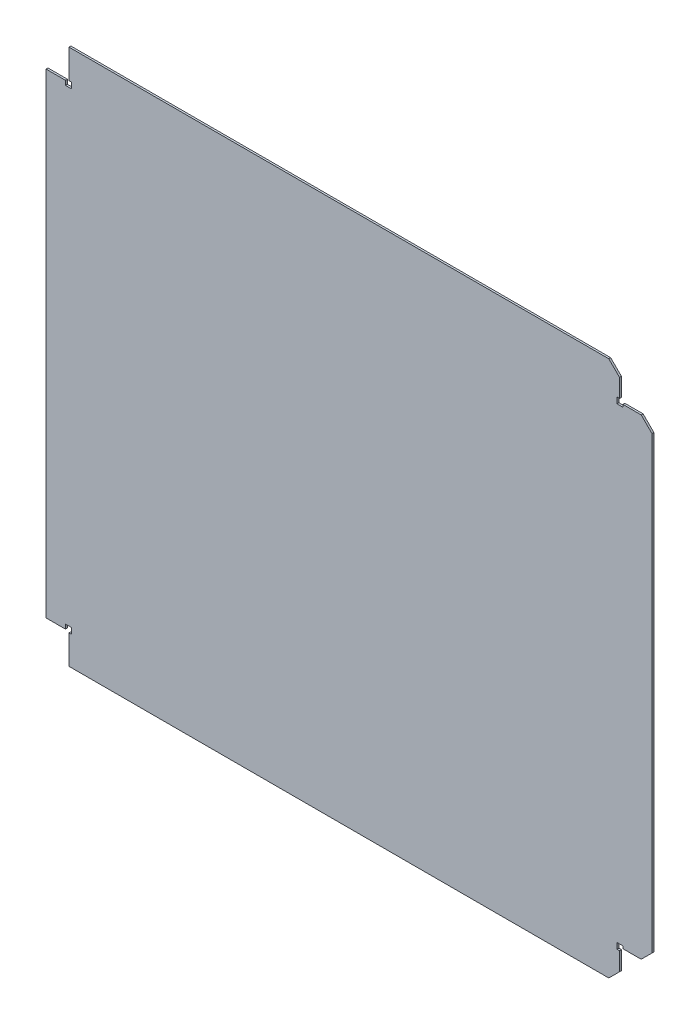
ISO-10303-21;
HEADER;
FILE_DESCRIPTION(('STEP AP214'),'2;1');
FILE_NAME('part.step','',(''),(''),'','','');
FILE_SCHEMA(('AUTOMOTIVE_DESIGN { 1 0 10303 214 1 1 1 1 }'));
ENDSEC;
DATA;
#1=APPLICATION_CONTEXT('core data for automotive mechanical design processes');
#2=APPLICATION_PROTOCOL_DEFINITION('international standard','automotive_design',2000,#1);
#3=PRODUCT_CONTEXT('',#1,'mechanical');
#4=PRODUCT('Part','Part','',(#3));
#5=PRODUCT_RELATED_PRODUCT_CATEGORY('part','',(#4));
#6=PRODUCT_DEFINITION_FORMATION('','',#4);
#7=PRODUCT_DEFINITION_CONTEXT('part definition',#1,'design');
#8=PRODUCT_DEFINITION('design','',#6,#7);
#9=PRODUCT_DEFINITION_SHAPE('','',#8);
#10=(LENGTH_UNIT() NAMED_UNIT(*) SI_UNIT(.MILLI.,.METRE.));
#11=(NAMED_UNIT(*) PLANE_ANGLE_UNIT() SI_UNIT($,.RADIAN.));
#12=(NAMED_UNIT(*) SI_UNIT($,.STERADIAN.) SOLID_ANGLE_UNIT());
#13=UNCERTAINTY_MEASURE_WITH_UNIT(LENGTH_MEASURE(1.E-05),#10,'distance_accuracy_value','');
#14=(GEOMETRIC_REPRESENTATION_CONTEXT(3) GLOBAL_UNCERTAINTY_ASSIGNED_CONTEXT((#13)) GLOBAL_UNIT_ASSIGNED_CONTEXT((#10,
#11,#12)) REPRESENTATION_CONTEXT('',''));
#15=CARTESIAN_POINT('',(0.,0.,0.));
#16=DIRECTION('',(0.,0.,1.));
#17=DIRECTION('',(1.,0.,0.));
#18=AXIS2_PLACEMENT_3D('',#15,#16,#17);
#19=CARTESIAN_POINT('',(172.2,0.,-895.746524373547));
#20=DIRECTION('',(1.,0.,0.));
#21=DIRECTION('',(0.,0.,-1.));
#22=AXIS2_PLACEMENT_3D('',#19,#20,#21);
#23=PLANE('',#22);
#24=DIRECTION('',(0.,0.,1.));
#25=VECTOR('',#24,1.);
#26=CARTESIAN_POINT('',(172.2,-147.2,-895.746524373547));
#27=LINE('',#26,#25);
#28=CARTESIAN_POINT('',(172.2,-147.2,13.8));
#29=VERTEX_POINT('',#28);
#30=CARTESIAN_POINT('',(172.2,-147.2,14.9999999999998));
#31=VERTEX_POINT('',#30);
#32=EDGE_CURVE('E526',#29,#31,#27,.T.);
#33=ORIENTED_EDGE('',*,*,#32,.T.);
#34=DIRECTION('',(0.,1.,0.));
#35=VECTOR('',#34,1.);
#36=CARTESIAN_POINT('',(172.2,0.,15.));
#37=LINE('',#36,#35);
#38=CARTESIAN_POINT('',(172.2,-150.913274122872,15.));
#39=VERTEX_POINT('',#38);
#40=EDGE_CURVE('E94',#39,#31,#37,.T.);
#41=ORIENTED_EDGE('',*,*,#40,.F.);
#42=DIRECTION('',(0.,0.,1.));
#43=VECTOR('',#42,1.);
#44=CARTESIAN_POINT('',(172.2,-150.913274122872,-681.452585149753));
#45=LINE('',#44,#43);
#46=CARTESIAN_POINT('',(172.2,-150.913274122872,13.8));
#47=VERTEX_POINT('',#46);
#48=EDGE_CURVE('E463',#47,#39,#45,.T.);
#49=ORIENTED_EDGE('',*,*,#48,.F.);
#50=DIRECTION('',(0.,1.,0.));
#51=VECTOR('',#50,1.);
#52=CARTESIAN_POINT('',(172.2,0.,13.8));
#53=LINE('',#52,#51);
#54=EDGE_CURVE('E515',#47,#29,#53,.T.);
#55=ORIENTED_EDGE('',*,*,#54,.T.);
#56=EDGE_LOOP('',(#33,#41,#49,#55));
#57=FACE_BOUND('',#56,.T.);
#58=ADVANCED_FACE('F79',(#57),#23,.T.);
#59=CARTESIAN_POINT('',(-172.2,0.,-895.746524373547));
#60=DIRECTION('',(-1.,0.,0.));
#61=DIRECTION('',(0.,0.,1.));
#62=AXIS2_PLACEMENT_3D('',#59,#60,#61);
#63=PLANE('',#62);
#64=DIRECTION('',(0.,-1.,0.));
#65=VECTOR('',#64,1.);
#66=CARTESIAN_POINT('',(-172.2,0.,13.8));
#67=LINE('',#66,#65);
#68=CARTESIAN_POINT('',(-172.2,-147.2,13.7999999999998));
#69=VERTEX_POINT('',#68);
#70=CARTESIAN_POINT('',(-172.2,-150.913274122872,13.8));
#71=VERTEX_POINT('',#70);
#72=EDGE_CURVE('E518',#69,#71,#67,.T.);
#73=ORIENTED_EDGE('',*,*,#72,.T.);
#74=DIRECTION('',(0.,0.,1.));
#75=VECTOR('',#74,1.);
#76=CARTESIAN_POINT('',(-172.2,-150.913274122872,-681.452585149753));
#77=LINE('',#76,#75);
#78=CARTESIAN_POINT('',(-172.2,-150.913274122872,15.));
#79=VERTEX_POINT('',#78);
#80=EDGE_CURVE('E443',#71,#79,#77,.T.);
#81=ORIENTED_EDGE('',*,*,#80,.T.);
#82=DIRECTION('',(0.,-1.,0.));
#83=VECTOR('',#82,1.);
#84=CARTESIAN_POINT('',(-172.2,0.,15.));
#85=LINE('',#84,#83);
#86=CARTESIAN_POINT('',(-172.2,-147.2,15.));
#87=VERTEX_POINT('',#86);
#88=EDGE_CURVE('E511',#87,#79,#85,.T.);
#89=ORIENTED_EDGE('',*,*,#88,.F.);
#90=DIRECTION('',(0.,0.,1.));
#91=VECTOR('',#90,1.);
#92=CARTESIAN_POINT('',(-172.2,-147.2,-895.746524373547));
#93=LINE('',#92,#91);
#94=EDGE_CURVE('E12',#69,#87,#93,.T.);
#95=ORIENTED_EDGE('',*,*,#94,.F.);
#96=EDGE_LOOP('',(#73,#81,#89,#95));
#97=FACE_BOUND('',#96,.T.);
#98=ADVANCED_FACE('F607',(#97),#63,.T.);
#99=CARTESIAN_POINT('',(0.,-147.2,-895.746524373547));
#100=DIRECTION('',(0.,-1.,0.));
#101=DIRECTION('',(0.,0.,-1.));
#102=AXIS2_PLACEMENT_3D('',#99,#100,#101);
#103=PLANE('',#102);
#104=ORIENTED_EDGE('',*,*,#94,.T.);
#105=DIRECTION('',(1.,0.,0.));
#106=VECTOR('',#105,1.);
#107=CARTESIAN_POINT('',(0.,-147.2,15.));
#108=LINE('',#107,#106);
#109=CARTESIAN_POINT('',(-175.913274122872,-147.2,15.));
#110=VERTEX_POINT('',#109);
#111=EDGE_CURVE('E509',#110,#87,#108,.T.);
#112=ORIENTED_EDGE('',*,*,#111,.F.);
#113=DIRECTION('',(0.,0.,1.));
#114=VECTOR('',#113,1.);
#115=CARTESIAN_POINT('',(-175.913274122872,-147.2,-586.745885007965));
#116=LINE('',#115,#114);
#117=CARTESIAN_POINT('',(-175.913274122872,-147.2,13.8));
#118=VERTEX_POINT('',#117);
#119=EDGE_CURVE('E1188',#118,#110,#116,.T.);
#120=ORIENTED_EDGE('',*,*,#119,.F.);
#121=DIRECTION('',(1.,0.,0.));
#122=VECTOR('',#121,1.);
#123=CARTESIAN_POINT('',(0.,-147.2,13.8));
#124=LINE('',#123,#122);
#125=EDGE_CURVE('E101',#118,#69,#124,.T.);
#126=ORIENTED_EDGE('',*,*,#125,.T.);
#127=EDGE_LOOP('',(#104,#112,#120,#126));
#128=FACE_BOUND('',#127,.T.);
#129=ADVANCED_FACE('F611',(#128),#103,.T.);
#130=CARTESIAN_POINT('',(0.,147.2,-895.746524373547));
#131=DIRECTION('',(0.,1.,0.));
#132=DIRECTION('',(0.,0.,1.));
#133=AXIS2_PLACEMENT_3D('',#130,#131,#132);
#134=PLANE('',#133);
#135=DIRECTION('',(-1.,0.,0.));
#136=VECTOR('',#135,1.);
#137=CARTESIAN_POINT('',(0.,147.2,13.8));
#138=LINE('',#137,#136);
#139=CARTESIAN_POINT('',(-172.2,147.2,13.7999999999998));
#140=VERTEX_POINT('',#139);
#141=CARTESIAN_POINT('',(-175.913274122872,147.2,13.8));
#142=VERTEX_POINT('',#141);
#143=EDGE_CURVE('E289',#140,#142,#138,.T.);
#144=ORIENTED_EDGE('',*,*,#143,.T.);
#145=DIRECTION('',(0.,0.,1.));
#146=VECTOR('',#145,1.);
#147=CARTESIAN_POINT('',(-175.913274122872,147.2,-586.745885007965));
#148=LINE('',#147,#146);
#149=CARTESIAN_POINT('',(-175.913274122872,147.2,15.));
#150=VERTEX_POINT('',#149);
#151=EDGE_CURVE('E293',#142,#150,#148,.T.);
#152=ORIENTED_EDGE('',*,*,#151,.T.);
#153=DIRECTION('',(-1.,0.,0.));
#154=VECTOR('',#153,1.);
#155=CARTESIAN_POINT('',(0.,147.2,15.));
#156=LINE('',#155,#154);
#157=CARTESIAN_POINT('',(-172.2,147.2,15.));
#158=VERTEX_POINT('',#157);
#159=EDGE_CURVE('E507',#158,#150,#156,.T.);
#160=ORIENTED_EDGE('',*,*,#159,.F.);
#161=DIRECTION('',(0.,0.,1.));
#162=VECTOR('',#161,1.);
#163=CARTESIAN_POINT('',(-172.2,147.2,-895.746524373547));
#164=LINE('',#163,#162);
#165=EDGE_CURVE('E87',#140,#158,#164,.T.);
#166=ORIENTED_EDGE('',*,*,#165,.F.);
#167=EDGE_LOOP('',(#144,#152,#160,#166));
#168=FACE_BOUND('',#167,.T.);
#169=ADVANCED_FACE('F291',(#168),#134,.T.);
#170=CARTESIAN_POINT('',(-172.2,0.,-895.746524373547));
#171=DIRECTION('',(-1.,0.,0.));
#172=DIRECTION('',(0.,0.,1.));
#173=AXIS2_PLACEMENT_3D('',#170,#171,#172);
#174=PLANE('',#173);
#175=ORIENTED_EDGE('',*,*,#165,.T.);
#176=DIRECTION('',(0.,-1.,0.));
#177=VECTOR('',#176,1.);
#178=CARTESIAN_POINT('',(-172.2,0.,15.));
#179=LINE('',#178,#177);
#180=CARTESIAN_POINT('',(-172.2,150.913274122872,15.));
#181=VERTEX_POINT('',#180);
#182=EDGE_CURVE('E505',#181,#158,#179,.T.);
#183=ORIENTED_EDGE('',*,*,#182,.F.);
#184=DIRECTION('',(0.,0.,1.));
#185=VECTOR('',#184,1.);
#186=CARTESIAN_POINT('',(-172.2,150.913274122872,-681.452585149753));
#187=LINE('',#186,#185);
#188=CARTESIAN_POINT('',(-172.2,150.913274122872,13.8));
#189=VERTEX_POINT('',#188);
#190=EDGE_CURVE('E339',#189,#181,#187,.T.);
#191=ORIENTED_EDGE('',*,*,#190,.F.);
#192=DIRECTION('',(0.,-1.,0.));
#193=VECTOR('',#192,1.);
#194=CARTESIAN_POINT('',(-172.2,0.,13.8));
#195=LINE('',#194,#193);
#196=EDGE_CURVE('E297',#189,#140,#195,.T.);
#197=ORIENTED_EDGE('',*,*,#196,.T.);
#198=EDGE_LOOP('',(#175,#183,#191,#197));
#199=FACE_BOUND('',#198,.T.);
#200=ADVANCED_FACE('F532',(#199),#174,.T.);
#201=CARTESIAN_POINT('',(172.2,0.,-895.746524373547));
#202=DIRECTION('',(1.,0.,0.));
#203=DIRECTION('',(0.,0.,-1.));
#204=AXIS2_PLACEMENT_3D('',#201,#202,#203);
#205=PLANE('',#204);
#206=DIRECTION('',(0.,1.,0.));
#207=VECTOR('',#206,1.);
#208=CARTESIAN_POINT('',(172.2,0.,13.8));
#209=LINE('',#208,#207);
#210=CARTESIAN_POINT('',(172.2,147.2,13.7999999999998));
#211=VERTEX_POINT('',#210);
#212=CARTESIAN_POINT('',(172.2,150.913274122872,13.8));
#213=VERTEX_POINT('',#212);
#214=EDGE_CURVE('E522',#211,#213,#209,.T.);
#215=ORIENTED_EDGE('',*,*,#214,.T.);
#216=DIRECTION('',(0.,0.,1.));
#217=VECTOR('',#216,1.);
#218=CARTESIAN_POINT('',(172.2,150.913274122872,-681.452585149753));
#219=LINE('',#218,#217);
#220=CARTESIAN_POINT('',(172.2,150.913274122872,15.));
#221=VERTEX_POINT('',#220);
#222=EDGE_CURVE('E318',#213,#221,#219,.T.);
#223=ORIENTED_EDGE('',*,*,#222,.T.);
#224=DIRECTION('',(0.,1.,0.));
#225=VECTOR('',#224,1.);
#226=CARTESIAN_POINT('',(172.2,0.,15.));
#227=LINE('',#226,#225);
#228=CARTESIAN_POINT('',(172.2,147.2,15.));
#229=VERTEX_POINT('',#228);
#230=EDGE_CURVE('E503',#229,#221,#227,.T.);
#231=ORIENTED_EDGE('',*,*,#230,.F.);
#232=DIRECTION('',(0.,0.,1.));
#233=VECTOR('',#232,1.);
#234=CARTESIAN_POINT('',(172.2,147.2,-895.746524373547));
#235=LINE('',#234,#233);
#236=EDGE_CURVE('E529',#211,#229,#235,.T.);
#237=ORIENTED_EDGE('',*,*,#236,.F.);
#238=EDGE_LOOP('',(#215,#223,#231,#237));
#239=FACE_BOUND('',#238,.T.);
#240=ADVANCED_FACE('F563',(#239),#205,.T.);
#241=CARTESIAN_POINT('',(0.,147.2,-895.746524373547));
#242=DIRECTION('',(0.,1.,0.));
#243=DIRECTION('',(0.,0.,1.));
#244=AXIS2_PLACEMENT_3D('',#241,#242,#243);
#245=PLANE('',#244);
#246=ORIENTED_EDGE('',*,*,#236,.T.);
#247=DIRECTION('',(-1.,0.,0.));
#248=VECTOR('',#247,1.);
#249=CARTESIAN_POINT('',(0.,147.2,15.));
#250=LINE('',#249,#248);
#251=CARTESIAN_POINT('',(175.913274122872,147.2,15.));
#252=VERTEX_POINT('',#251);
#253=EDGE_CURVE('E501',#252,#229,#250,.T.);
#254=ORIENTED_EDGE('',*,*,#253,.F.);
#255=DIRECTION('',(0.,0.,1.));
#256=VECTOR('',#255,1.);
#257=CARTESIAN_POINT('',(175.913274122872,147.2,-581.636102380041));
#258=LINE('',#257,#256);
#259=CARTESIAN_POINT('',(175.913274122872,147.2,13.8));
#260=VERTEX_POINT('',#259);
#261=EDGE_CURVE('E397',#260,#252,#258,.T.);
#262=ORIENTED_EDGE('',*,*,#261,.F.);
#263=DIRECTION('',(-1.,0.,0.));
#264=VECTOR('',#263,1.);
#265=CARTESIAN_POINT('',(0.,147.2,13.8));
#266=LINE('',#265,#264);
#267=EDGE_CURVE('E524',#260,#211,#266,.T.);
#268=ORIENTED_EDGE('',*,*,#267,.T.);
#269=EDGE_LOOP('',(#246,#254,#262,#268));
#270=FACE_BOUND('',#269,.T.);
#271=ADVANCED_FACE('F572',(#270),#245,.T.);
#272=CARTESIAN_POINT('',(0.,-147.2,-895.746524373547));
#273=DIRECTION('',(0.,-1.,0.));
#274=DIRECTION('',(0.,0.,-1.));
#275=AXIS2_PLACEMENT_3D('',#272,#273,#274);
#276=PLANE('',#275);
#277=DIRECTION('',(1.,0.,0.));
#278=VECTOR('',#277,1.);
#279=CARTESIAN_POINT('',(0.,-147.2,13.8));
#280=LINE('',#279,#278);
#281=CARTESIAN_POINT('',(175.913274122872,-147.2,13.8));
#282=VERTEX_POINT('',#281);
#283=EDGE_CURVE('E513',#29,#282,#280,.T.);
#284=ORIENTED_EDGE('',*,*,#283,.T.);
#285=DIRECTION('',(0.,0.,1.));
#286=VECTOR('',#285,1.);
#287=CARTESIAN_POINT('',(175.913274122872,-147.2,-581.636102380041));
#288=LINE('',#287,#286);
#289=CARTESIAN_POINT('',(175.913274122872,-147.2,15.));
#290=VERTEX_POINT('',#289);
#291=EDGE_CURVE('E373',#282,#290,#288,.T.);
#292=ORIENTED_EDGE('',*,*,#291,.T.);
#293=DIRECTION('',(1.,0.,0.));
#294=VECTOR('',#293,1.);
#295=CARTESIAN_POINT('',(0.,-147.2,15.));
#296=LINE('',#295,#294);
#297=EDGE_CURVE('E499',#31,#290,#296,.T.);
#298=ORIENTED_EDGE('',*,*,#297,.F.);
#299=ORIENTED_EDGE('',*,*,#32,.F.);
#300=EDGE_LOOP('',(#284,#292,#298,#299));
#301=FACE_BOUND('',#300,.T.);
#302=ADVANCED_FACE('F598',(#301),#276,.T.);
#303=CARTESIAN_POINT('',(0.,0.,13.8));
#304=DIRECTION('',(0.,0.,1.));
#305=DIRECTION('',(1.,0.,0.));
#306=AXIS2_PLACEMENT_3D('',#303,#304,#305);
#307=PLANE('',#306);
#308=ORIENTED_EDGE('',*,*,#54,.F.);
#309=DIRECTION('',(-1.,0.,0.));
#310=VECTOR('',#309,1.);
#311=CARTESIAN_POINT('',(-175.,-150.913274122872,13.8));
#312=LINE('',#311,#310);
#313=CARTESIAN_POINT('',(173.764644660941,-150.913274122872,13.8));
#314=VERTEX_POINT('',#313);
#315=EDGE_CURVE('E466',#314,#47,#312,.T.);
#316=ORIENTED_EDGE('',*,*,#315,.F.);
#317=DIRECTION('',(0.,1.,0.));
#318=VECTOR('',#317,1.);
#319=CARTESIAN_POINT('',(173.764644660941,-162.169911184308,13.8));
#320=LINE('',#319,#318);
#321=CARTESIAN_POINT('',(173.764644660941,-162.426548245744,13.8));
#322=VERTEX_POINT('',#321);
#323=EDGE_CURVE('E454',#314,#322,#320,.F.);
#324=ORIENTED_EDGE('',*,*,#323,.T.);
#325=DIRECTION('',(-0.707106781186547,-0.707106781186548,0.));
#326=VECTOR('',#325,1.);
#327=CARTESIAN_POINT('',(12.4823223304704,-323.708870576214,13.8));
#328=LINE('',#327,#326);
#329=CARTESIAN_POINT('',(166.964644660941,-169.226548245744,13.8));
#330=VERTEX_POINT('',#329);
#331=EDGE_CURVE('E477',#322,#330,#328,.T.);
#332=ORIENTED_EDGE('',*,*,#331,.T.);
#333=DIRECTION('',(-1.,0.,0.));
#334=VECTOR('',#333,1.);
#335=CARTESIAN_POINT('',(-173.8,-169.226548245744,13.8));
#336=LINE('',#335,#334);
#337=CARTESIAN_POINT('',(-173.7,-169.226548245744,13.8));
#338=VERTEX_POINT('',#337);
#339=EDGE_CURVE('E475',#330,#338,#336,.T.);
#340=ORIENTED_EDGE('',*,*,#339,.T.);
#341=DIRECTION('',(0.,-1.,0.));
#342=VECTOR('',#341,1.);
#343=CARTESIAN_POINT('',(-173.7,-154.826548245744,13.8));
#344=LINE('',#343,#342);
#345=CARTESIAN_POINT('',(-173.7,-150.913274122872,13.8));
#346=VERTEX_POINT('',#345);
#347=EDGE_CURVE('E376',#346,#338,#344,.T.);
#348=ORIENTED_EDGE('',*,*,#347,.F.);
#349=DIRECTION('',(-1.,0.,0.));
#350=VECTOR('',#349,1.);
#351=CARTESIAN_POINT('',(-175.,-150.913274122872,13.8));
#352=LINE('',#351,#350);
#353=EDGE_CURVE('E460',#71,#346,#352,.T.);
#354=ORIENTED_EDGE('',*,*,#353,.F.);
#355=ORIENTED_EDGE('',*,*,#72,.F.);
#356=ORIENTED_EDGE('',*,*,#125,.F.);
#357=DIRECTION('',(0.,1.,0.));
#358=VECTOR('',#357,1.);
#359=CARTESIAN_POINT('',(-175.913274122872,-150.,13.8));
#360=LINE('',#359,#358);
#361=CARTESIAN_POINT('',(-175.913274122872,-150.,13.8));
#362=VERTEX_POINT('',#361);
#363=EDGE_CURVE('E1185',#362,#118,#360,.T.);
#364=ORIENTED_EDGE('',*,*,#363,.F.);
#365=DIRECTION('',(-1.,0.,0.));
#366=VECTOR('',#365,1.);
#367=CARTESIAN_POINT('',(-165.613274122872,-150.,13.8));
#368=LINE('',#367,#366);
#369=CARTESIAN_POINT('',(-188.113274122872,-150.,13.8));
#370=VERTEX_POINT('',#369);
#371=EDGE_CURVE('E1191',#362,#370,#368,.T.);
#372=ORIENTED_EDGE('',*,*,#371,.T.);
#373=DIRECTION('',(0.,1.,0.));
#374=VECTOR('',#373,1.);
#375=CARTESIAN_POINT('',(-188.113274122872,142.,13.8));
#376=LINE('',#375,#374);
#377=CARTESIAN_POINT('',(-188.113274122872,150.,13.8));
#378=VERTEX_POINT('',#377);
#379=EDGE_CURVE('E1194',#370,#378,#376,.T.);
#380=ORIENTED_EDGE('',*,*,#379,.T.);
#381=DIRECTION('',(1.,0.,0.));
#382=VECTOR('',#381,1.);
#383=CARTESIAN_POINT('',(-195.613274122872,150.,13.8));
#384=LINE('',#383,#382);
#385=CARTESIAN_POINT('',(-175.913274122872,150.,13.8));
#386=VERTEX_POINT('',#385);
#387=EDGE_CURVE('E311',#378,#386,#384,.T.);
#388=ORIENTED_EDGE('',*,*,#387,.T.);
#389=DIRECTION('',(0.,1.,0.));
#390=VECTOR('',#389,1.);
#391=CARTESIAN_POINT('',(-175.913274122872,-150.,13.8));
#392=LINE('',#391,#390);
#393=EDGE_CURVE('E303',#142,#386,#392,.T.);
#394=ORIENTED_EDGE('',*,*,#393,.F.);
#395=ORIENTED_EDGE('',*,*,#143,.F.);
#396=ORIENTED_EDGE('',*,*,#196,.F.);
#397=DIRECTION('',(1.,0.,0.));
#398=VECTOR('',#397,1.);
#399=CARTESIAN_POINT('',(-175.,150.913274122872,13.8));
#400=LINE('',#399,#398);
#401=CARTESIAN_POINT('',(-173.7,150.913274122872,13.8));
#402=VERTEX_POINT('',#401);
#403=EDGE_CURVE('E342',#402,#189,#400,.T.);
#404=ORIENTED_EDGE('',*,*,#403,.F.);
#405=DIRECTION('',(0.,-1.,0.));
#406=VECTOR('',#405,1.);
#407=CARTESIAN_POINT('',(-173.7,175.626548245744,13.8));
#408=LINE('',#407,#406);
#409=CARTESIAN_POINT('',(-173.7,169.226548245744,13.8));
#410=VERTEX_POINT('',#409);
#411=EDGE_CURVE('E359',#410,#402,#408,.T.);
#412=ORIENTED_EDGE('',*,*,#411,.F.);
#413=DIRECTION('',(1.,0.,0.));
#414=VECTOR('',#413,1.);
#415=CARTESIAN_POINT('',(167.,169.226548245744,13.8));
#416=LINE('',#415,#414);
#417=CARTESIAN_POINT('',(166.964644660941,169.226548245744,13.8));
#418=VERTEX_POINT('',#417);
#419=EDGE_CURVE('E352',#410,#418,#416,.T.);
#420=ORIENTED_EDGE('',*,*,#419,.T.);
#421=DIRECTION('',(0.707106781186548,-0.707106781186548,0.));
#422=VECTOR('',#421,1.);
#423=CARTESIAN_POINT('',(12.4823223304704,323.708870576214,13.8));
#424=LINE('',#423,#422);
#425=CARTESIAN_POINT('',(173.764644660941,162.426548245744,13.8));
#426=VERTEX_POINT('',#425);
#427=EDGE_CURVE('E350',#418,#426,#424,.T.);
#428=ORIENTED_EDGE('',*,*,#427,.T.);
#429=DIRECTION('',(0.,1.,0.));
#430=VECTOR('',#429,1.);
#431=CARTESIAN_POINT('',(173.764644660941,162.169911184308,13.8));
#432=LINE('',#431,#430);
#433=CARTESIAN_POINT('',(173.764644660941,150.913274122872,13.8));
#434=VERTEX_POINT('',#433);
#435=EDGE_CURVE('E331',#426,#434,#432,.F.);
#436=ORIENTED_EDGE('',*,*,#435,.T.);
#437=DIRECTION('',(1.,0.,0.));
#438=VECTOR('',#437,1.);
#439=CARTESIAN_POINT('',(-175.,150.913274122872,13.8));
#440=LINE('',#439,#438);
#441=EDGE_CURVE('E336',#213,#434,#440,.T.);
#442=ORIENTED_EDGE('',*,*,#441,.F.);
#443=ORIENTED_EDGE('',*,*,#214,.F.);
#444=ORIENTED_EDGE('',*,*,#267,.F.);
#445=DIRECTION('',(0.,-1.,0.));
#446=VECTOR('',#445,1.);
#447=CARTESIAN_POINT('',(175.913274122872,-150.,13.8));
#448=LINE('',#447,#446);
#449=CARTESIAN_POINT('',(175.913274122872,148.764644660941,13.8));
#450=VERTEX_POINT('',#449);
#451=EDGE_CURVE('E400',#450,#260,#448,.T.);
#452=ORIENTED_EDGE('',*,*,#451,.F.);
#453=DIRECTION('',(-1.,0.,0.));
#454=VECTOR('',#453,1.);
#455=CARTESIAN_POINT('',(187.169911184308,148.764644660941,13.8));
#456=LINE('',#455,#454);
#457=CARTESIAN_POINT('',(187.426548245744,148.764644660941,13.8));
#458=VERTEX_POINT('',#457);
#459=EDGE_CURVE('E386',#450,#458,#456,.F.);
#460=ORIENTED_EDGE('',*,*,#459,.T.);
#461=DIRECTION('',(0.707106781186548,-0.707106781186547,0.));
#462=VECTOR('',#461,1.);
#463=CARTESIAN_POINT('',(348.708870576214,-12.5176776695296,13.8));
#464=LINE('',#463,#462);
#465=CARTESIAN_POINT('',(194.226548245744,141.964644660941,13.8));
#466=VERTEX_POINT('',#465);
#467=EDGE_CURVE('E421',#458,#466,#464,.T.);
#468=ORIENTED_EDGE('',*,*,#467,.T.);
#469=DIRECTION('',(0.,-1.,0.));
#470=VECTOR('',#469,1.);
#471=CARTESIAN_POINT('',(194.226548245744,-142.,13.8));
#472=LINE('',#471,#470);
#473=CARTESIAN_POINT('',(194.226548245744,-141.964644660941,13.8));
#474=VERTEX_POINT('',#473);
#475=EDGE_CURVE('E416',#466,#474,#472,.T.);
#476=ORIENTED_EDGE('',*,*,#475,.T.);
#477=DIRECTION('',(-0.707106781186547,-0.707106781186548,0.));
#478=VECTOR('',#477,1.);
#479=CARTESIAN_POINT('',(348.708870576214,12.5176776695297,13.8));
#480=LINE('',#479,#478);
#481=CARTESIAN_POINT('',(187.426548245744,-148.764644660941,13.8));
#482=VERTEX_POINT('',#481);
#483=EDGE_CURVE('E414',#474,#482,#480,.T.);
#484=ORIENTED_EDGE('',*,*,#483,.T.);
#485=DIRECTION('',(-1.,0.,0.));
#486=VECTOR('',#485,1.);
#487=CARTESIAN_POINT('',(187.169911184308,-148.764644660941,13.8));
#488=LINE('',#487,#486);
#489=CARTESIAN_POINT('',(175.913274122872,-148.764644660941,13.8));
#490=VERTEX_POINT('',#489);
#491=EDGE_CURVE('E389',#482,#490,#488,.T.);
#492=ORIENTED_EDGE('',*,*,#491,.T.);
#493=DIRECTION('',(0.,-1.,0.));
#494=VECTOR('',#493,1.);
#495=CARTESIAN_POINT('',(175.913274122872,-150.,13.8));
#496=LINE('',#495,#494);
#497=EDGE_CURVE('E394',#282,#490,#496,.T.);
#498=ORIENTED_EDGE('',*,*,#497,.F.);
#499=ORIENTED_EDGE('',*,*,#283,.F.);
#500=EDGE_LOOP('',(#308,#316,#324,#332,#340,#348,#354,#355,#356,#364,#372,#380,#388,#394,#395,
#396,#404,#412,#420,#428,#436,#442,#443,#444,#452,#460,#468,#476,#484,#492,#498,#499));
#501=FACE_BOUND('',#500,.T.);
#502=ADVANCED_FACE('F81',(#501),#307,.F.);
#503=CARTESIAN_POINT('',(0.,0.,15.));
#504=DIRECTION('',(0.,0.,1.));
#505=DIRECTION('',(1.,0.,0.));
#506=AXIS2_PLACEMENT_3D('',#503,#504,#505);
#507=PLANE('',#506);
#508=ORIENTED_EDGE('',*,*,#88,.T.);
#509=DIRECTION('',(-1.,0.,0.));
#510=VECTOR('',#509,1.);
#511=CARTESIAN_POINT('',(-175.,-150.913274122872,15.));
#512=LINE('',#511,#510);
#513=CARTESIAN_POINT('',(-173.7,-150.913274122872,15.));
#514=VERTEX_POINT('',#513);
#515=EDGE_CURVE('E446',#79,#514,#512,.T.);
#516=ORIENTED_EDGE('',*,*,#515,.T.);
#517=DIRECTION('',(0.,-1.,0.));
#518=VECTOR('',#517,1.);
#519=CARTESIAN_POINT('',(-173.7,-154.826548245744,15.));
#520=LINE('',#519,#518);
#521=CARTESIAN_POINT('',(-173.7,-169.226548245744,14.9999999999999));
#522=VERTEX_POINT('',#521);
#523=EDGE_CURVE('E479',#514,#522,#520,.T.);
#524=ORIENTED_EDGE('',*,*,#523,.T.);
#525=DIRECTION('',(-1.,0.,0.));
#526=VECTOR('',#525,1.);
#527=CARTESIAN_POINT('',(-173.8,-169.226548245744,14.9999999999999));
#528=LINE('',#527,#526);
#529=CARTESIAN_POINT('',(166.964644660941,-169.226548245744,15.));
#530=VERTEX_POINT('',#529);
#531=EDGE_CURVE('E486',#530,#522,#528,.T.);
#532=ORIENTED_EDGE('',*,*,#531,.F.);
#533=DIRECTION('',(-0.707106781186547,-0.707106781186548,0.));
#534=VECTOR('',#533,1.);
#535=CARTESIAN_POINT('',(12.4823223304704,-323.708870576214,15.));
#536=LINE('',#535,#534);
#537=CARTESIAN_POINT('',(173.764644660941,-162.426548245744,15.));
#538=VERTEX_POINT('',#537);
#539=EDGE_CURVE('E484',#538,#530,#536,.T.);
#540=ORIENTED_EDGE('',*,*,#539,.F.);
#541=DIRECTION('',(0.,1.,0.));
#542=VECTOR('',#541,1.);
#543=CARTESIAN_POINT('',(173.764644660941,-162.169911184308,15.));
#544=LINE('',#543,#542);
#545=CARTESIAN_POINT('',(173.764644660941,-150.913274122872,15.));
#546=VERTEX_POINT('',#545);
#547=EDGE_CURVE('E472',#546,#538,#544,.F.);
#548=ORIENTED_EDGE('',*,*,#547,.F.);
#549=DIRECTION('',(-1.,0.,0.));
#550=VECTOR('',#549,1.);
#551=CARTESIAN_POINT('',(-175.,-150.913274122872,15.));
#552=LINE('',#551,#550);
#553=EDGE_CURVE('E449',#546,#39,#552,.T.);
#554=ORIENTED_EDGE('',*,*,#553,.T.);
#555=ORIENTED_EDGE('',*,*,#40,.T.);
#556=ORIENTED_EDGE('',*,*,#297,.T.);
#557=DIRECTION('',(0.,-1.,0.));
#558=VECTOR('',#557,1.);
#559=CARTESIAN_POINT('',(175.913274122872,-150.,15.));
#560=LINE('',#559,#558);
#561=CARTESIAN_POINT('',(175.913274122872,-148.764644660941,15.));
#562=VERTEX_POINT('',#561);
#563=EDGE_CURVE('E377',#290,#562,#560,.T.);
#564=ORIENTED_EDGE('',*,*,#563,.T.);
#565=DIRECTION('',(-1.,0.,0.));
#566=VECTOR('',#565,1.);
#567=CARTESIAN_POINT('',(187.169911184308,-148.764644660941,15.));
#568=LINE('',#567,#566);
#569=CARTESIAN_POINT('',(187.426548245744,-148.764644660941,15.));
#570=VERTEX_POINT('',#569);
#571=EDGE_CURVE('E412',#570,#562,#568,.T.);
#572=ORIENTED_EDGE('',*,*,#571,.F.);
#573=DIRECTION('',(-0.707106781186547,-0.707106781186548,0.));
#574=VECTOR('',#573,1.);
#575=CARTESIAN_POINT('',(348.708870576214,12.5176776695297,15.));
#576=LINE('',#575,#574);
#577=CARTESIAN_POINT('',(194.226548245744,-141.964644660941,15.));
#578=VERTEX_POINT('',#577);
#579=EDGE_CURVE('E424',#578,#570,#576,.T.);
#580=ORIENTED_EDGE('',*,*,#579,.F.);
#581=DIRECTION('',(0.,-1.,0.));
#582=VECTOR('',#581,1.);
#583=CARTESIAN_POINT('',(194.226548245744,-142.,15.));
#584=LINE('',#583,#582);
#585=CARTESIAN_POINT('',(194.226548245744,141.964644660941,15.));
#586=VERTEX_POINT('',#585);
#587=EDGE_CURVE('E436',#586,#578,#584,.T.);
#588=ORIENTED_EDGE('',*,*,#587,.F.);
#589=DIRECTION('',(0.707106781186548,-0.707106781186547,0.));
#590=VECTOR('',#589,1.);
#591=CARTESIAN_POINT('',(348.708870576214,-12.5176776695296,15.));
#592=LINE('',#591,#590);
#593=CARTESIAN_POINT('',(187.426548245744,148.764644660941,15.));
#594=VERTEX_POINT('',#593);
#595=EDGE_CURVE('E433',#594,#586,#592,.T.);
#596=ORIENTED_EDGE('',*,*,#595,.F.);
#597=DIRECTION('',(-1.,0.,0.));
#598=VECTOR('',#597,1.);
#599=CARTESIAN_POINT('',(187.169911184308,148.764644660941,15.));
#600=LINE('',#599,#598);
#601=CARTESIAN_POINT('',(175.913274122872,148.764644660941,15.));
#602=VERTEX_POINT('',#601);
#603=EDGE_CURVE('E406',#602,#594,#600,.F.);
#604=ORIENTED_EDGE('',*,*,#603,.F.);
#605=DIRECTION('',(0.,-1.,0.));
#606=VECTOR('',#605,1.);
#607=CARTESIAN_POINT('',(175.913274122872,-150.,15.));
#608=LINE('',#607,#606);
#609=EDGE_CURVE('E380',#602,#252,#608,.T.);
#610=ORIENTED_EDGE('',*,*,#609,.T.);
#611=ORIENTED_EDGE('',*,*,#253,.T.);
#612=ORIENTED_EDGE('',*,*,#230,.T.);
#613=DIRECTION('',(1.,0.,0.));
#614=VECTOR('',#613,1.);
#615=CARTESIAN_POINT('',(-175.,150.913274122872,15.));
#616=LINE('',#615,#614);
#617=CARTESIAN_POINT('',(173.764644660941,150.913274122872,15.));
#618=VERTEX_POINT('',#617);
#619=EDGE_CURVE('E322',#221,#618,#616,.T.);
#620=ORIENTED_EDGE('',*,*,#619,.T.);
#621=DIRECTION('',(0.,1.,0.));
#622=VECTOR('',#621,1.);
#623=CARTESIAN_POINT('',(173.764644660941,162.169911184308,15.));
#624=LINE('',#623,#622);
#625=CARTESIAN_POINT('',(173.764644660941,162.426548245744,15.));
#626=VERTEX_POINT('',#625);
#627=EDGE_CURVE('E348',#626,#618,#624,.F.);
#628=ORIENTED_EDGE('',*,*,#627,.F.);
#629=DIRECTION('',(0.707106781186548,-0.707106781186548,0.));
#630=VECTOR('',#629,1.);
#631=CARTESIAN_POINT('',(12.4823223304704,323.708870576214,15.));
#632=LINE('',#631,#630);
#633=CARTESIAN_POINT('',(166.964644660941,169.226548245744,15.));
#634=VERTEX_POINT('',#633);
#635=EDGE_CURVE('E361',#634,#626,#632,.T.);
#636=ORIENTED_EDGE('',*,*,#635,.F.);
#637=DIRECTION('',(1.,0.,0.));
#638=VECTOR('',#637,1.);
#639=CARTESIAN_POINT('',(167.,169.226548245744,15.));
#640=LINE('',#639,#638);
#641=CARTESIAN_POINT('',(-173.7,169.226548245744,15.));
#642=VERTEX_POINT('',#641);
#643=EDGE_CURVE('E368',#642,#634,#640,.T.);
#644=ORIENTED_EDGE('',*,*,#643,.F.);
#645=DIRECTION('',(0.,-1.,0.));
#646=VECTOR('',#645,1.);
#647=CARTESIAN_POINT('',(-173.7,175.626548245744,15.));
#648=LINE('',#647,#646);
#649=CARTESIAN_POINT('',(-173.7,150.913274122872,15.));
#650=VERTEX_POINT('',#649);
#651=EDGE_CURVE('E357',#642,#650,#648,.T.);
#652=ORIENTED_EDGE('',*,*,#651,.T.);
#653=DIRECTION('',(1.,0.,0.));
#654=VECTOR('',#653,1.);
#655=CARTESIAN_POINT('',(-175.,150.913274122872,15.));
#656=LINE('',#655,#654);
#657=EDGE_CURVE('E325',#650,#181,#656,.T.);
#658=ORIENTED_EDGE('',*,*,#657,.T.);
#659=ORIENTED_EDGE('',*,*,#182,.T.);
#660=ORIENTED_EDGE('',*,*,#159,.T.);
#661=DIRECTION('',(0.,1.,0.));
#662=VECTOR('',#661,1.);
#663=CARTESIAN_POINT('',(-175.913274122872,-150.,15.));
#664=LINE('',#663,#662);
#665=CARTESIAN_POINT('',(-175.913274122872,150.,15.));
#666=VERTEX_POINT('',#665);
#667=EDGE_CURVE('E305',#150,#666,#664,.T.);
#668=ORIENTED_EDGE('',*,*,#667,.T.);
#669=DIRECTION('',(-1.,0.,0.));
#670=VECTOR('',#669,1.);
#671=CARTESIAN_POINT('',(-173.113274122872,150.,15.));
#672=LINE('',#671,#670);
#673=CARTESIAN_POINT('',(-188.113274122872,150.,15.));
#674=VERTEX_POINT('',#673);
#675=EDGE_CURVE('E1173',#666,#674,#672,.T.);
#676=ORIENTED_EDGE('',*,*,#675,.T.);
#677=DIRECTION('',(0.,-1.,0.));
#678=VECTOR('',#677,1.);
#679=CARTESIAN_POINT('',(-188.113274122872,-150.,15.));
#680=LINE('',#679,#678);
#681=CARTESIAN_POINT('',(-188.113274122872,-150.,15.));
#682=VERTEX_POINT('',#681);
#683=EDGE_CURVE('E1199',#674,#682,#680,.T.);
#684=ORIENTED_EDGE('',*,*,#683,.T.);
#685=DIRECTION('',(-1.,0.,0.));
#686=VECTOR('',#685,1.);
#687=CARTESIAN_POINT('',(-173.113274122872,-150.,15.));
#688=LINE('',#687,#686);
#689=CARTESIAN_POINT('',(-175.913274122872,-150.,15.));
#690=VERTEX_POINT('',#689);
#691=EDGE_CURVE('E1182',#690,#682,#688,.T.);
#692=ORIENTED_EDGE('',*,*,#691,.F.);
#693=DIRECTION('',(0.,1.,0.));
#694=VECTOR('',#693,1.);
#695=CARTESIAN_POINT('',(-175.913274122872,-150.,15.));
#696=LINE('',#695,#694);
#697=EDGE_CURVE('E307',#690,#110,#696,.T.);
#698=ORIENTED_EDGE('',*,*,#697,.T.);
#699=ORIENTED_EDGE('',*,*,#111,.T.);
#700=EDGE_LOOP('',(#508,#516,#524,#532,#540,#548,#554,#555,#556,#564,#572,#580,#588,#596,#604,
#610,#611,#612,#620,#628,#636,#644,#652,#658,#659,#660,#668,#676,#684,#692,#698,#699));
#701=FACE_BOUND('',#700,.T.);
#702=ADVANCED_FACE('F573',(#701),#507,.T.);
#703=CARTESIAN_POINT('',(-173.7,-154.826548245744,-679.226377564467));
#704=DIRECTION('',(-1.,0.,0.));
#705=DIRECTION('',(0.,-1.,0.));
#706=AXIS2_PLACEMENT_3D('',#703,#704,#705);
#707=PLANE('',#706);
#708=ORIENTED_EDGE('',*,*,#523,.F.);
#709=DIRECTION('',(0.,0.,1.));
#710=VECTOR('',#709,1.);
#711=CARTESIAN_POINT('',(-173.7,-150.913274122872,-681.452585149753));
#712=LINE('',#711,#710);
#713=EDGE_CURVE('E457',#346,#514,#712,.T.);
#714=ORIENTED_EDGE('',*,*,#713,.F.);
#715=ORIENTED_EDGE('',*,*,#347,.T.);
#716=DIRECTION('',(0.,0.,1.));
#717=VECTOR('',#716,1.);
#718=CARTESIAN_POINT('',(-173.7,-169.226548245744,-679.226377564467));
#719=LINE('',#718,#717);
#720=EDGE_CURVE('E494',#338,#522,#719,.T.);
#721=ORIENTED_EDGE('',*,*,#720,.T.);
#722=EDGE_LOOP('',(#708,#714,#715,#721));
#723=FACE_BOUND('',#722,.T.);
#724=ADVANCED_FACE('F629',(#723),#707,.T.);
#725=CARTESIAN_POINT('',(-173.8,-169.226548245744,-679.226377564467));
#726=DIRECTION('',(0.,1.,0.));
#727=DIRECTION('',(0.,0.,1.));
#728=AXIS2_PLACEMENT_3D('',#725,#726,#727);
#729=PLANE('',#728);
#730=DIRECTION('',(0.,0.,1.));
#731=VECTOR('',#730,1.);
#732=CARTESIAN_POINT('',(166.964644660941,-169.226548245744,-679.226377564467));
#733=LINE('',#732,#731);
#734=EDGE_CURVE('E491',#330,#530,#733,.T.);
#735=ORIENTED_EDGE('',*,*,#734,.T.);
#736=ORIENTED_EDGE('',*,*,#531,.T.);
#737=ORIENTED_EDGE('',*,*,#720,.F.);
#738=ORIENTED_EDGE('',*,*,#339,.F.);
#739=EDGE_LOOP('',(#735,#736,#737,#738));
#740=FACE_BOUND('',#739,.T.);
#741=ADVANCED_FACE('F643',(#740),#729,.F.);
#742=CARTESIAN_POINT('',(12.4823223304704,-323.708870576214,-679.226377564467));
#743=DIRECTION('',(-0.707106781186548,0.707106781186547,0.));
#744=DIRECTION('',(-0.707106781186547,-0.707106781186548,0.));
#745=AXIS2_PLACEMENT_3D('',#742,#743,#744);
#746=PLANE('',#745);
#747=ORIENTED_EDGE('',*,*,#331,.F.);
#748=DIRECTION('',(0.,0.,-1.));
#749=VECTOR('',#748,1.);
#750=CARTESIAN_POINT('',(173.764644660941,-162.426548245744,14.4));
#751=LINE('',#750,#749);
#752=EDGE_CURVE('E469',#538,#322,#751,.T.);
#753=ORIENTED_EDGE('',*,*,#752,.F.);
#754=ORIENTED_EDGE('',*,*,#539,.T.);
#755=ORIENTED_EDGE('',*,*,#734,.F.);
#756=EDGE_LOOP('',(#747,#753,#754,#755));
#757=FACE_BOUND('',#756,.T.);
#758=ADVANCED_FACE('F639',(#757),#746,.F.);
#759=CARTESIAN_POINT('',(173.764644660941,-162.169911184308,14.4));
#760=DIRECTION('',(-1.,0.,0.));
#761=DIRECTION('',(0.,1.,0.));
#762=AXIS2_PLACEMENT_3D('',#759,#760,#761);
#763=PLANE('',#762);
#764=ORIENTED_EDGE('',*,*,#323,.F.);
#765=DIRECTION('',(0.,0.,1.));
#766=VECTOR('',#765,1.);
#767=CARTESIAN_POINT('',(173.764644660941,-150.913274122872,-681.452585149753));
#768=LINE('',#767,#766);
#769=EDGE_CURVE('E451',#314,#546,#768,.T.);
#770=ORIENTED_EDGE('',*,*,#769,.T.);
#771=ORIENTED_EDGE('',*,*,#547,.T.);
#772=ORIENTED_EDGE('',*,*,#752,.T.);
#773=EDGE_LOOP('',(#764,#770,#771,#772));
#774=FACE_BOUND('',#773,.T.);
#775=ADVANCED_FACE('F636',(#774),#763,.F.);
#776=CARTESIAN_POINT('',(-175.,-150.913274122872,-681.452585149753));
#777=DIRECTION('',(0.,1.,0.));
#778=DIRECTION('',(-1.,0.,0.));
#779=AXIS2_PLACEMENT_3D('',#776,#777,#778);
#780=PLANE('',#779);
#781=ORIENTED_EDGE('',*,*,#553,.F.);
#782=ORIENTED_EDGE('',*,*,#769,.F.);
#783=ORIENTED_EDGE('',*,*,#315,.T.);
#784=ORIENTED_EDGE('',*,*,#48,.T.);
#785=EDGE_LOOP('',(#781,#782,#783,#784));
#786=FACE_BOUND('',#785,.T.);
#787=ADVANCED_FACE('F605',(#786),#780,.T.);
#788=CARTESIAN_POINT('',(-175.,-150.913274122872,-681.452585149753));
#789=DIRECTION('',(0.,1.,0.));
#790=DIRECTION('',(-1.,0.,0.));
#791=AXIS2_PLACEMENT_3D('',#788,#789,#790);
#792=PLANE('',#791);
#793=ORIENTED_EDGE('',*,*,#515,.F.);
#794=ORIENTED_EDGE('',*,*,#80,.F.);
#795=ORIENTED_EDGE('',*,*,#353,.T.);
#796=ORIENTED_EDGE('',*,*,#713,.T.);
#797=EDGE_LOOP('',(#793,#794,#795,#796));
#798=FACE_BOUND('',#797,.T.);
#799=ADVANCED_FACE('F630',(#798),#792,.T.);
#800=CARTESIAN_POINT('',(194.226548245744,-142.,-577.372397349864));
#801=DIRECTION('',(-1.,0.,0.));
#802=DIRECTION('',(0.,0.,1.));
#803=AXIS2_PLACEMENT_3D('',#800,#801,#802);
#804=PLANE('',#803);
#805=DIRECTION('',(0.,0.,1.));
#806=VECTOR('',#805,1.);
#807=CARTESIAN_POINT('',(194.226548245744,141.964644660941,-577.372397349864));
#808=LINE('',#807,#806);
#809=EDGE_CURVE('E321',#466,#586,#808,.T.);
#810=ORIENTED_EDGE('',*,*,#809,.T.);
#811=ORIENTED_EDGE('',*,*,#587,.T.);
#812=DIRECTION('',(0.,0.,1.));
#813=VECTOR('',#812,1.);
#814=CARTESIAN_POINT('',(194.226548245744,-141.964644660941,-577.372397349864));
#815=LINE('',#814,#813);
#816=EDGE_CURVE('E428',#474,#578,#815,.T.);
#817=ORIENTED_EDGE('',*,*,#816,.F.);
#818=ORIENTED_EDGE('',*,*,#475,.F.);
#819=EDGE_LOOP('',(#810,#811,#817,#818));
#820=FACE_BOUND('',#819,.T.);
#821=ADVANCED_FACE('F581',(#820),#804,.F.);
#822=CARTESIAN_POINT('',(348.708870576214,-12.5176776695297,-577.372397349864));
#823=DIRECTION('',(-0.707106781186547,-0.707106781186548,0.));
#824=DIRECTION('',(0.707106781186548,-0.707106781186547,0.));
#825=AXIS2_PLACEMENT_3D('',#822,#823,#824);
#826=PLANE('',#825);
#827=ORIENTED_EDGE('',*,*,#467,.F.);
#828=DIRECTION('',(0.,0.,-1.));
#829=VECTOR('',#828,1.);
#830=CARTESIAN_POINT('',(187.426548245744,148.764644660941,14.4));
#831=LINE('',#830,#829);
#832=EDGE_CURVE('E403',#594,#458,#831,.T.);
#833=ORIENTED_EDGE('',*,*,#832,.F.);
#834=ORIENTED_EDGE('',*,*,#595,.T.);
#835=ORIENTED_EDGE('',*,*,#809,.F.);
#836=EDGE_LOOP('',(#827,#833,#834,#835));
#837=FACE_BOUND('',#836,.T.);
#838=ADVANCED_FACE('F579',(#837),#826,.F.);
#839=CARTESIAN_POINT('',(348.708870576214,12.5176776695296,-577.372397349864));
#840=DIRECTION('',(-0.707106781186548,0.707106781186547,0.));
#841=DIRECTION('',(-0.707106781186547,-0.707106781186548,0.));
#842=AXIS2_PLACEMENT_3D('',#839,#840,#841);
#843=PLANE('',#842);
#844=ORIENTED_EDGE('',*,*,#816,.T.);
#845=ORIENTED_EDGE('',*,*,#579,.T.);
#846=DIRECTION('',(0.,0.,-1.));
#847=VECTOR('',#846,1.);
#848=CARTESIAN_POINT('',(187.426548245744,-148.764644660941,14.4));
#849=LINE('',#848,#847);
#850=EDGE_CURVE('E409',#570,#482,#849,.T.);
#851=ORIENTED_EDGE('',*,*,#850,.T.);
#852=ORIENTED_EDGE('',*,*,#483,.F.);
#853=EDGE_LOOP('',(#844,#845,#851,#852));
#854=FACE_BOUND('',#853,.T.);
#855=ADVANCED_FACE('F584',(#854),#843,.F.);
#856=CARTESIAN_POINT('',(187.169911184308,-148.764644660941,14.4));
#857=DIRECTION('',(0.,-1.,0.));
#858=DIRECTION('',(-1.,0.,0.));
#859=AXIS2_PLACEMENT_3D('',#856,#857,#858);
#860=PLANE('',#859);
#861=ORIENTED_EDGE('',*,*,#571,.T.);
#862=DIRECTION('',(0.,0.,1.));
#863=VECTOR('',#862,1.);
#864=CARTESIAN_POINT('',(175.913274122872,-148.764644660941,-581.636102380041));
#865=LINE('',#864,#863);
#866=EDGE_CURVE('E391',#490,#562,#865,.T.);
#867=ORIENTED_EDGE('',*,*,#866,.F.);
#868=ORIENTED_EDGE('',*,*,#491,.F.);
#869=ORIENTED_EDGE('',*,*,#850,.F.);
#870=EDGE_LOOP('',(#861,#867,#868,#869));
#871=FACE_BOUND('',#870,.T.);
#872=ADVANCED_FACE('F595',(#871),#860,.T.);
#873=CARTESIAN_POINT('',(187.169911184308,148.764644660941,14.4));
#874=DIRECTION('',(0.,-1.,0.));
#875=DIRECTION('',(-1.,0.,0.));
#876=AXIS2_PLACEMENT_3D('',#873,#874,#875);
#877=PLANE('',#876);
#878=ORIENTED_EDGE('',*,*,#459,.F.);
#879=DIRECTION('',(0.,0.,1.));
#880=VECTOR('',#879,1.);
#881=CARTESIAN_POINT('',(175.913274122872,148.764644660941,-581.636102380041));
#882=LINE('',#881,#880);
#883=EDGE_CURVE('E383',#450,#602,#882,.T.);
#884=ORIENTED_EDGE('',*,*,#883,.T.);
#885=ORIENTED_EDGE('',*,*,#603,.T.);
#886=ORIENTED_EDGE('',*,*,#832,.T.);
#887=EDGE_LOOP('',(#878,#884,#885,#886));
#888=FACE_BOUND('',#887,.T.);
#889=ADVANCED_FACE('F575',(#888),#877,.F.);
#890=CARTESIAN_POINT('',(175.913274122872,-150.,-581.636102380041));
#891=DIRECTION('',(-1.,0.,0.));
#892=DIRECTION('',(0.,0.,1.));
#893=AXIS2_PLACEMENT_3D('',#890,#891,#892);
#894=PLANE('',#893);
#895=ORIENTED_EDGE('',*,*,#609,.F.);
#896=ORIENTED_EDGE('',*,*,#883,.F.);
#897=ORIENTED_EDGE('',*,*,#451,.T.);
#898=ORIENTED_EDGE('',*,*,#261,.T.);
#899=EDGE_LOOP('',(#895,#896,#897,#898));
#900=FACE_BOUND('',#899,.T.);
#901=ADVANCED_FACE('F571',(#900),#894,.T.);
#902=CARTESIAN_POINT('',(175.913274122872,-150.,-581.636102380041));
#903=DIRECTION('',(-1.,0.,0.));
#904=DIRECTION('',(0.,0.,1.));
#905=AXIS2_PLACEMENT_3D('',#902,#903,#904);
#906=PLANE('',#905);
#907=ORIENTED_EDGE('',*,*,#563,.F.);
#908=ORIENTED_EDGE('',*,*,#291,.F.);
#909=ORIENTED_EDGE('',*,*,#497,.T.);
#910=ORIENTED_EDGE('',*,*,#866,.T.);
#911=EDGE_LOOP('',(#907,#908,#909,#910));
#912=FACE_BOUND('',#911,.T.);
#913=ADVANCED_FACE('F594',(#912),#906,.T.);
#914=CARTESIAN_POINT('',(167.,169.226548245743,-679.226377564467));
#915=DIRECTION('',(0.,-1.,0.));
#916=DIRECTION('',(0.,0.,-1.));
#917=AXIS2_PLACEMENT_3D('',#914,#915,#916);
#918=PLANE('',#917);
#919=DIRECTION('',(0.,0.,1.));
#920=VECTOR('',#919,1.);
#921=CARTESIAN_POINT('',(-173.7,169.226548245743,-679.226377564467));
#922=LINE('',#921,#920);
#923=EDGE_CURVE('E306',#410,#642,#922,.T.);
#924=ORIENTED_EDGE('',*,*,#923,.T.);
#925=ORIENTED_EDGE('',*,*,#643,.T.);
#926=DIRECTION('',(0.,0.,1.));
#927=VECTOR('',#926,1.);
#928=CARTESIAN_POINT('',(166.964644660941,169.226548245743,-679.226377564467));
#929=LINE('',#928,#927);
#930=EDGE_CURVE('E363',#418,#634,#929,.T.);
#931=ORIENTED_EDGE('',*,*,#930,.F.);
#932=ORIENTED_EDGE('',*,*,#419,.F.);
#933=EDGE_LOOP('',(#924,#925,#931,#932));
#934=FACE_BOUND('',#933,.T.);
#935=ADVANCED_FACE('F546',(#934),#918,.F.);
#936=CARTESIAN_POINT('',(12.4823223304704,323.708870576214,-679.226377564467));
#937=DIRECTION('',(-0.707106781186548,-0.707106781186548,0.));
#938=DIRECTION('',(0.707106781186548,-0.707106781186548,0.));
#939=AXIS2_PLACEMENT_3D('',#936,#937,#938);
#940=PLANE('',#939);
#941=ORIENTED_EDGE('',*,*,#930,.T.);
#942=ORIENTED_EDGE('',*,*,#635,.T.);
#943=DIRECTION('',(0.,0.,-1.));
#944=VECTOR('',#943,1.);
#945=CARTESIAN_POINT('',(173.764644660941,162.426548245744,14.4));
#946=LINE('',#945,#944);
#947=EDGE_CURVE('E345',#626,#426,#946,.T.);
#948=ORIENTED_EDGE('',*,*,#947,.T.);
#949=ORIENTED_EDGE('',*,*,#427,.F.);
#950=EDGE_LOOP('',(#941,#942,#948,#949));
#951=FACE_BOUND('',#950,.T.);
#952=ADVANCED_FACE('F548',(#951),#940,.F.);
#953=CARTESIAN_POINT('',(-173.7,175.626548245743,-679.226377564467));
#954=DIRECTION('',(-1.,0.,0.));
#955=DIRECTION('',(0.,0.,1.));
#956=AXIS2_PLACEMENT_3D('',#953,#954,#955);
#957=PLANE('',#956);
#958=ORIENTED_EDGE('',*,*,#651,.F.);
#959=ORIENTED_EDGE('',*,*,#923,.F.);
#960=ORIENTED_EDGE('',*,*,#411,.T.);
#961=DIRECTION('',(0.,0.,1.));
#962=VECTOR('',#961,1.);
#963=CARTESIAN_POINT('',(-173.7,150.913274122872,-681.452585149753));
#964=LINE('',#963,#962);
#965=EDGE_CURVE('E328',#402,#650,#964,.T.);
#966=ORIENTED_EDGE('',*,*,#965,.T.);
#967=EDGE_LOOP('',(#958,#959,#960,#966));
#968=FACE_BOUND('',#967,.T.);
#969=ADVANCED_FACE('F542',(#968),#957,.T.);
#970=CARTESIAN_POINT('',(173.764644660941,162.169911184308,14.4));
#971=DIRECTION('',(-1.,0.,0.));
#972=DIRECTION('',(0.,1.,0.));
#973=AXIS2_PLACEMENT_3D('',#970,#971,#972);
#974=PLANE('',#973);
#975=ORIENTED_EDGE('',*,*,#627,.T.);
#976=DIRECTION('',(0.,0.,1.));
#977=VECTOR('',#976,1.);
#978=CARTESIAN_POINT('',(173.764644660941,150.913274122872,-681.452585149753));
#979=LINE('',#978,#977);
#980=EDGE_CURVE('E333',#434,#618,#979,.T.);
#981=ORIENTED_EDGE('',*,*,#980,.F.);
#982=ORIENTED_EDGE('',*,*,#435,.F.);
#983=ORIENTED_EDGE('',*,*,#947,.F.);
#984=EDGE_LOOP('',(#975,#981,#982,#983));
#985=FACE_BOUND('',#984,.T.);
#986=ADVANCED_FACE('F554',(#985),#974,.F.);
#987=CARTESIAN_POINT('',(-175.,150.913274122872,-681.452585149753));
#988=DIRECTION('',(0.,-1.,0.));
#989=DIRECTION('',(0.,0.,-1.));
#990=AXIS2_PLACEMENT_3D('',#987,#988,#989);
#991=PLANE('',#990);
#992=ORIENTED_EDGE('',*,*,#657,.F.);
#993=ORIENTED_EDGE('',*,*,#965,.F.);
#994=ORIENTED_EDGE('',*,*,#403,.T.);
#995=ORIENTED_EDGE('',*,*,#190,.T.);
#996=EDGE_LOOP('',(#992,#993,#994,#995));
#997=FACE_BOUND('',#996,.T.);
#998=ADVANCED_FACE('F539',(#997),#991,.T.);
#999=CARTESIAN_POINT('',(-175.,150.913274122872,-681.452585149753));
#1000=DIRECTION('',(0.,-1.,0.));
#1001=DIRECTION('',(0.,0.,-1.));
#1002=AXIS2_PLACEMENT_3D('',#999,#1000,#1001);
#1003=PLANE('',#1002);
#1004=ORIENTED_EDGE('',*,*,#619,.F.);
#1005=ORIENTED_EDGE('',*,*,#222,.F.);
#1006=ORIENTED_EDGE('',*,*,#441,.T.);
#1007=ORIENTED_EDGE('',*,*,#980,.T.);
#1008=EDGE_LOOP('',(#1004,#1005,#1006,#1007));
#1009=FACE_BOUND('',#1008,.T.);
#1010=ADVANCED_FACE('F560',(#1009),#1003,.T.);
#1011=CARTESIAN_POINT('',(-175.913274122872,-150.,-586.745885007965));
#1012=DIRECTION('',(1.,0.,0.));
#1013=DIRECTION('',(0.,0.,-1.));
#1014=AXIS2_PLACEMENT_3D('',#1011,#1012,#1013);
#1015=PLANE('',#1014);
#1016=ORIENTED_EDGE('',*,*,#667,.F.);
#1017=ORIENTED_EDGE('',*,*,#151,.F.);
#1018=ORIENTED_EDGE('',*,*,#393,.T.);
#1019=DIRECTION('',(0.,0.,1.));
#1020=VECTOR('',#1019,1.);
#1021=CARTESIAN_POINT('',(-175.913274122872,150.,-586.745885007965));
#1022=LINE('',#1021,#1020);
#1023=EDGE_CURVE('E312',#386,#666,#1022,.T.);
#1024=ORIENTED_EDGE('',*,*,#1023,.T.);
#1025=EDGE_LOOP('',(#1016,#1017,#1018,#1024));
#1026=FACE_BOUND('',#1025,.T.);
#1027=ADVANCED_FACE('F301',(#1026),#1015,.T.);
#1028=CARTESIAN_POINT('',(-195.613274122872,150.,-586.745885007965));
#1029=DIRECTION('',(0.,-1.,0.));
#1030=DIRECTION('',(0.,0.,-1.));
#1031=AXIS2_PLACEMENT_3D('',#1028,#1029,#1030);
#1032=PLANE('',#1031);
#1033=DIRECTION('',(0.,0.,1.));
#1034=VECTOR('',#1033,1.);
#1035=CARTESIAN_POINT('',(-188.113274122872,150.,-586.745885007965));
#1036=LINE('',#1035,#1034);
#1037=EDGE_CURVE('E314',#378,#674,#1036,.T.);
#1038=ORIENTED_EDGE('',*,*,#1037,.T.);
#1039=ORIENTED_EDGE('',*,*,#675,.F.);
#1040=ORIENTED_EDGE('',*,*,#1023,.F.);
#1041=ORIENTED_EDGE('',*,*,#387,.F.);
#1042=EDGE_LOOP('',(#1038,#1039,#1040,#1041));
#1043=FACE_BOUND('',#1042,.T.);
#1044=ADVANCED_FACE('F688',(#1043),#1032,.F.);
#1045=CARTESIAN_POINT('',(-188.113274122872,142.,-586.745885007965));
#1046=DIRECTION('',(1.,0.,0.));
#1047=DIRECTION('',(0.,0.,-1.));
#1048=AXIS2_PLACEMENT_3D('',#1045,#1046,#1047);
#1049=PLANE('',#1048);
#1050=DIRECTION('',(0.,0.,1.));
#1051=VECTOR('',#1050,1.);
#1052=CARTESIAN_POINT('',(-188.113274122872,-150.,-586.745885007965));
#1053=LINE('',#1052,#1051);
#1054=EDGE_CURVE('E1175',#370,#682,#1053,.T.);
#1055=ORIENTED_EDGE('',*,*,#1054,.T.);
#1056=ORIENTED_EDGE('',*,*,#683,.F.);
#1057=ORIENTED_EDGE('',*,*,#1037,.F.);
#1058=ORIENTED_EDGE('',*,*,#379,.F.);
#1059=EDGE_LOOP('',(#1055,#1056,#1057,#1058));
#1060=FACE_BOUND('',#1059,.T.);
#1061=ADVANCED_FACE('F684',(#1060),#1049,.F.);
#1062=CARTESIAN_POINT('',(-165.613274122872,-150.,-586.745885007965));
#1063=DIRECTION('',(0.,1.,0.));
#1064=DIRECTION('',(0.,0.,1.));
#1065=AXIS2_PLACEMENT_3D('',#1062,#1063,#1064);
#1066=PLANE('',#1065);
#1067=DIRECTION('',(0.,0.,1.));
#1068=VECTOR('',#1067,1.);
#1069=CARTESIAN_POINT('',(-175.913274122872,-150.,-586.745885007965));
#1070=LINE('',#1069,#1068);
#1071=EDGE_CURVE('E1177',#362,#690,#1070,.T.);
#1072=ORIENTED_EDGE('',*,*,#1071,.T.);
#1073=ORIENTED_EDGE('',*,*,#691,.T.);
#1074=ORIENTED_EDGE('',*,*,#1054,.F.);
#1075=ORIENTED_EDGE('',*,*,#371,.F.);
#1076=EDGE_LOOP('',(#1072,#1073,#1074,#1075));
#1077=FACE_BOUND('',#1076,.T.);
#1078=ADVANCED_FACE('F680',(#1077),#1066,.F.);
#1079=CARTESIAN_POINT('',(-175.913274122872,-150.,-586.745885007965));
#1080=DIRECTION('',(1.,0.,0.));
#1081=DIRECTION('',(0.,0.,-1.));
#1082=AXIS2_PLACEMENT_3D('',#1079,#1080,#1081);
#1083=PLANE('',#1082);
#1084=ORIENTED_EDGE('',*,*,#697,.F.);
#1085=ORIENTED_EDGE('',*,*,#1071,.F.);
#1086=ORIENTED_EDGE('',*,*,#363,.T.);
#1087=ORIENTED_EDGE('',*,*,#119,.T.);
#1088=EDGE_LOOP('',(#1084,#1085,#1086,#1087));
#1089=FACE_BOUND('',#1088,.T.);
#1090=ADVANCED_FACE('F677',(#1089),#1083,.T.);
#1091=CLOSED_SHELL('',(#58,#98,#129,#169,#200,#240,#271,#302,#502,#702,#724,#741,#758,#775,#787,
#799,#821,#838,#855,#872,#889,#901,#913,#935,#952,#969,#986,#998,#1010,#1027,#1044,#1061,#1078,#1090));
#1092=MANIFOLD_SOLID_BREP('B2',#1091);
#1093=ADVANCED_BREP_SHAPE_REPRESENTATION('',(#18,#1092),#14);
#1094=SHAPE_DEFINITION_REPRESENTATION(#9,#1093);
ENDSEC;
END-ISO-10303-21;
